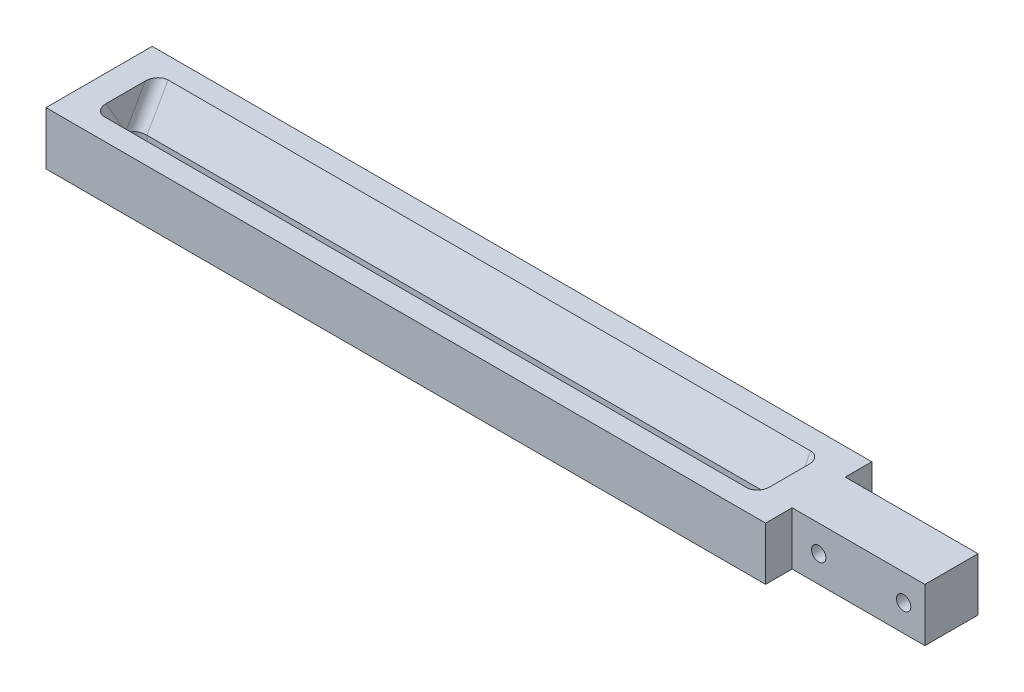
ISO-10303-21;
HEADER;
FILE_DESCRIPTION(('STEP AP214'),'2;1');
FILE_NAME('part.step','',(''),(''),'','','');
FILE_SCHEMA(('AUTOMOTIVE_DESIGN { 1 0 10303 214 1 1 1 1 }'));
ENDSEC;
DATA;
#1=APPLICATION_CONTEXT('core data for automotive mechanical design processes');
#2=APPLICATION_PROTOCOL_DEFINITION('international standard','automotive_design',2000,#1);
#3=PRODUCT_CONTEXT('',#1,'mechanical');
#4=PRODUCT('Part','Part','',(#3));
#5=PRODUCT_RELATED_PRODUCT_CATEGORY('part','',(#4));
#6=PRODUCT_DEFINITION_FORMATION('','',#4);
#7=PRODUCT_DEFINITION_CONTEXT('part definition',#1,'design');
#8=PRODUCT_DEFINITION('design','',#6,#7);
#9=PRODUCT_DEFINITION_SHAPE('','',#8);
#10=(LENGTH_UNIT() NAMED_UNIT(*) SI_UNIT(.MILLI.,.METRE.));
#11=(NAMED_UNIT(*) PLANE_ANGLE_UNIT() SI_UNIT($,.RADIAN.));
#12=(NAMED_UNIT(*) SI_UNIT($,.STERADIAN.) SOLID_ANGLE_UNIT());
#13=UNCERTAINTY_MEASURE_WITH_UNIT(LENGTH_MEASURE(1.E-05),#10,'distance_accuracy_value','');
#14=(GEOMETRIC_REPRESENTATION_CONTEXT(3) GLOBAL_UNCERTAINTY_ASSIGNED_CONTEXT((#13)) GLOBAL_UNIT_ASSIGNED_CONTEXT((#10,
#11,#12)) REPRESENTATION_CONTEXT('',''));
#15=CARTESIAN_POINT('',(0.,0.,0.));
#16=DIRECTION('',(0.,0.,1.));
#17=DIRECTION('',(1.,0.,0.));
#18=AXIS2_PLACEMENT_3D('',#15,#16,#17);
#19=CARTESIAN_POINT('',(0.,10.,0.));
#20=DIRECTION('',(0.,1.,0.));
#21=DIRECTION('',(0.,0.,1.));
#22=AXIS2_PLACEMENT_3D('',#19,#20,#21);
#23=PLANE('',#22);
#24=DIRECTION('',(1.,0.,0.));
#25=VECTOR('',#24,1.);
#26=CARTESIAN_POINT('',(93.,10.,-5.));
#27=LINE('',#26,#25);
#28=CARTESIAN_POINT('',(68.,10.,-5.));
#29=VERTEX_POINT('',#28);
#30=CARTESIAN_POINT('',(93.,10.,-5.));
#31=VERTEX_POINT('',#30);
#32=EDGE_CURVE('E51',#29,#31,#27,.T.);
#33=ORIENTED_EDGE('',*,*,#32,.F.);
#34=DIRECTION('',(0.,0.,1.));
#35=VECTOR('',#34,1.);
#36=CARTESIAN_POINT('',(68.,10.,-9.99999999999999));
#37=LINE('',#36,#35);
#38=CARTESIAN_POINT('',(68.,10.,-9.99999999999999));
#39=VERTEX_POINT('',#38);
#40=EDGE_CURVE('E287',#39,#29,#37,.T.);
#41=ORIENTED_EDGE('',*,*,#40,.F.);
#42=DIRECTION('',(-1.,0.,0.));
#43=VECTOR('',#42,1.);
#44=CARTESIAN_POINT('',(-67.5,10.,-10.));
#45=LINE('',#44,#43);
#46=CARTESIAN_POINT('',(-67.5,10.,-10.));
#47=VERTEX_POINT('',#46);
#48=EDGE_CURVE('E178',#39,#47,#45,.T.);
#49=ORIENTED_EDGE('',*,*,#48,.T.);
#50=DIRECTION('',(0.,0.,1.));
#51=VECTOR('',#50,1.);
#52=CARTESIAN_POINT('',(-67.5,10.,10.));
#53=LINE('',#52,#51);
#54=CARTESIAN_POINT('',(-67.5,10.,10.));
#55=VERTEX_POINT('',#54);
#56=EDGE_CURVE('E198',#47,#55,#53,.T.);
#57=ORIENTED_EDGE('',*,*,#56,.T.);
#58=DIRECTION('',(1.,0.,0.));
#59=VECTOR('',#58,1.);
#60=CARTESIAN_POINT('',(-67.5,10.,10.));
#61=LINE('',#60,#59);
#62=CARTESIAN_POINT('',(68.,10.,10.));
#63=VERTEX_POINT('',#62);
#64=EDGE_CURVE('E187',#55,#63,#61,.T.);
#65=ORIENTED_EDGE('',*,*,#64,.T.);
#66=DIRECTION('',(0.,0.,1.));
#67=VECTOR('',#66,1.);
#68=CARTESIAN_POINT('',(68.,10.,10.));
#69=LINE('',#68,#67);
#70=CARTESIAN_POINT('',(68.,10.,5.));
#71=VERTEX_POINT('',#70);
#72=EDGE_CURVE('E276',#71,#63,#69,.T.);
#73=ORIENTED_EDGE('',*,*,#72,.F.);
#74=DIRECTION('',(-1.,0.,0.));
#75=VECTOR('',#74,1.);
#76=CARTESIAN_POINT('',(93.,10.,5.));
#77=LINE('',#76,#75);
#78=CARTESIAN_POINT('',(93.,10.,5.));
#79=VERTEX_POINT('',#78);
#80=EDGE_CURVE('E280',#79,#71,#77,.T.);
#81=ORIENTED_EDGE('',*,*,#80,.F.);
#82=DIRECTION('',(0.,0.,-1.));
#83=VECTOR('',#82,1.);
#84=CARTESIAN_POINT('',(93.,10.,10.));
#85=LINE('',#84,#83);
#86=EDGE_CURVE('E294',#79,#31,#85,.T.);
#87=ORIENTED_EDGE('',*,*,#86,.T.);
#88=EDGE_LOOP('',(#33,#41,#49,#57,#65,#73,#81,#87));
#89=FACE_BOUND('',#88,.T.);
#90=DIRECTION('',(1.,0.,0.));
#91=VECTOR('',#90,1.);
#92=CARTESIAN_POINT('',(-62.5,10.,6.));
#93=LINE('',#92,#91);
#94=CARTESIAN_POINT('',(-60.5,10.,6.));
#95=VERTEX_POINT('',#94);
#96=CARTESIAN_POINT('',(60.5,10.,6.));
#97=VERTEX_POINT('',#96);
#98=EDGE_CURVE('E301',#95,#97,#93,.T.);
#99=ORIENTED_EDGE('',*,*,#98,.F.);
#100=CARTESIAN_POINT('',(-60.5,10.,3.69649778620041));
#101=DIRECTION('',(0.,1.,0.));
#102=DIRECTION('',(0.,0.,-1.));
#103=AXIS2_PLACEMENT_3D('',#100,#101,#102);
#104=ELLIPSE('',#103,2.30350221379959,2.);
#105=CARTESIAN_POINT('',(-62.5,10.,3.69649778620041));
#106=VERTEX_POINT('',#105);
#107=EDGE_CURVE('E232',#95,#106,#104,.F.);
#108=ORIENTED_EDGE('',*,*,#107,.T.);
#109=DIRECTION('',(0.,0.,1.));
#110=VECTOR('',#109,1.);
#111=CARTESIAN_POINT('',(-62.5,10.,-6.));
#112=LINE('',#111,#110);
#113=CARTESIAN_POINT('',(-62.5,10.,-3.69649778620041));
#114=VERTEX_POINT('',#113);
#115=EDGE_CURVE('E298',#114,#106,#112,.T.);
#116=ORIENTED_EDGE('',*,*,#115,.F.);
#117=CARTESIAN_POINT('',(-60.5,10.,-3.69649778620041));
#118=DIRECTION('',(0.,1.,0.));
#119=DIRECTION('',(0.,0.,-1.));
#120=AXIS2_PLACEMENT_3D('',#117,#118,#119);
#121=ELLIPSE('',#120,2.30350221379959,2.);
#122=CARTESIAN_POINT('',(-60.5,10.,-6.));
#123=VERTEX_POINT('',#122);
#124=EDGE_CURVE('E230',#114,#123,#121,.F.);
#125=ORIENTED_EDGE('',*,*,#124,.T.);
#126=DIRECTION('',(1.,0.,0.));
#127=VECTOR('',#126,1.);
#128=CARTESIAN_POINT('',(-62.5,10.,-6.));
#129=LINE('',#128,#127);
#130=CARTESIAN_POINT('',(60.5,10.,-6.));
#131=VERTEX_POINT('',#130);
#132=EDGE_CURVE('E190',#123,#131,#129,.T.);
#133=ORIENTED_EDGE('',*,*,#132,.T.);
#134=CARTESIAN_POINT('',(60.5,10.,-3.69649778620041));
#135=DIRECTION('',(0.,1.,0.));
#136=DIRECTION('',(0.,0.,1.));
#137=AXIS2_PLACEMENT_3D('',#134,#135,#136);
#138=ELLIPSE('',#137,2.30350221379959,2.);
#139=CARTESIAN_POINT('',(62.5,10.,-3.69649778620041));
#140=VERTEX_POINT('',#139);
#141=EDGE_CURVE('E228',#131,#140,#138,.F.);
#142=ORIENTED_EDGE('',*,*,#141,.T.);
#143=DIRECTION('',(0.,0.,1.));
#144=VECTOR('',#143,1.);
#145=CARTESIAN_POINT('',(62.5,10.,-6.));
#146=LINE('',#145,#144);
#147=CARTESIAN_POINT('',(62.5,10.,3.69649778620041));
#148=VERTEX_POINT('',#147);
#149=EDGE_CURVE('E248',#140,#148,#146,.T.);
#150=ORIENTED_EDGE('',*,*,#149,.T.);
#151=CARTESIAN_POINT('',(60.5,10.,3.69649778620041));
#152=DIRECTION('',(0.,1.,0.));
#153=DIRECTION('',(0.,0.,1.));
#154=AXIS2_PLACEMENT_3D('',#151,#152,#153);
#155=ELLIPSE('',#154,2.30350221379959,2.);
#156=EDGE_CURVE('E226',#148,#97,#155,.F.);
#157=ORIENTED_EDGE('',*,*,#156,.T.);
#158=EDGE_LOOP('',(#99,#108,#116,#125,#133,#142,#150,#157));
#159=FACE_BOUND('',#158,.T.);
#160=ADVANCED_FACE('F34',(#89,#159),#23,.T.);
#161=CARTESIAN_POINT('',(0.,0.,0.));
#162=DIRECTION('',(0.,1.,0.));
#163=DIRECTION('',(0.,0.,1.));
#164=AXIS2_PLACEMENT_3D('',#161,#162,#163);
#165=PLANE('',#164);
#166=DIRECTION('',(0.,0.,1.));
#167=VECTOR('',#166,1.);
#168=CARTESIAN_POINT('',(68.,0.,-9.99999999999999));
#169=LINE('',#168,#167);
#170=CARTESIAN_POINT('',(68.,0.,-9.99999999999999));
#171=VERTEX_POINT('',#170);
#172=CARTESIAN_POINT('',(68.,0.,-5.));
#173=VERTEX_POINT('',#172);
#174=EDGE_CURVE('E159',#171,#173,#169,.T.);
#175=ORIENTED_EDGE('',*,*,#174,.T.);
#176=DIRECTION('',(1.,0.,0.));
#177=VECTOR('',#176,1.);
#178=CARTESIAN_POINT('',(93.,0.,-5.));
#179=LINE('',#178,#177);
#180=CARTESIAN_POINT('',(93.,0.,-5.));
#181=VERTEX_POINT('',#180);
#182=EDGE_CURVE('E170',#173,#181,#179,.T.);
#183=ORIENTED_EDGE('',*,*,#182,.T.);
#184=DIRECTION('',(0.,0.,1.));
#185=VECTOR('',#184,1.);
#186=CARTESIAN_POINT('',(93.,0.,10.));
#187=LINE('',#186,#185);
#188=CARTESIAN_POINT('',(93.,0.,5.));
#189=VERTEX_POINT('',#188);
#190=EDGE_CURVE('E253',#181,#189,#187,.T.);
#191=ORIENTED_EDGE('',*,*,#190,.T.);
#192=DIRECTION('',(-1.,0.,0.));
#193=VECTOR('',#192,1.);
#194=CARTESIAN_POINT('',(93.,0.,5.));
#195=LINE('',#194,#193);
#196=CARTESIAN_POINT('',(68.,0.,5.));
#197=VERTEX_POINT('',#196);
#198=EDGE_CURVE('E59',#189,#197,#195,.T.);
#199=ORIENTED_EDGE('',*,*,#198,.T.);
#200=DIRECTION('',(0.,0.,1.));
#201=VECTOR('',#200,1.);
#202=CARTESIAN_POINT('',(68.,0.,10.));
#203=LINE('',#202,#201);
#204=CARTESIAN_POINT('',(68.,0.,10.));
#205=VERTEX_POINT('',#204);
#206=EDGE_CURVE('E275',#197,#205,#203,.T.);
#207=ORIENTED_EDGE('',*,*,#206,.T.);
#208=DIRECTION('',(1.,0.,0.));
#209=VECTOR('',#208,1.);
#210=CARTESIAN_POINT('',(-67.5,0.,10.));
#211=LINE('',#210,#209);
#212=CARTESIAN_POINT('',(-67.5,0.,10.));
#213=VERTEX_POINT('',#212);
#214=EDGE_CURVE('E185',#213,#205,#211,.T.);
#215=ORIENTED_EDGE('',*,*,#214,.F.);
#216=DIRECTION('',(0.,0.,1.));
#217=VECTOR('',#216,1.);
#218=CARTESIAN_POINT('',(-67.5,0.,10.));
#219=LINE('',#218,#217);
#220=CARTESIAN_POINT('',(-67.5,0.,-10.));
#221=VERTEX_POINT('',#220);
#222=EDGE_CURVE('E184',#221,#213,#219,.T.);
#223=ORIENTED_EDGE('',*,*,#222,.F.);
#224=DIRECTION('',(-1.,0.,0.));
#225=VECTOR('',#224,1.);
#226=CARTESIAN_POINT('',(-67.5,0.,-10.));
#227=LINE('',#226,#225);
#228=EDGE_CURVE('E176',#171,#221,#227,.T.);
#229=ORIENTED_EDGE('',*,*,#228,.F.);
#230=EDGE_LOOP('',(#175,#183,#191,#199,#207,#215,#223,#229));
#231=FACE_BOUND('',#230,.T.);
#232=CARTESIAN_POINT('',(-60.5,0.,0.));
#233=DIRECTION('',(0.,1.,0.));
#234=DIRECTION('',(0.,0.,1.));
#235=AXIS2_PLACEMENT_3D('',#232,#233,#234);
#236=CIRCLE('',#235,2.);
#237=CARTESIAN_POINT('',(-60.5,0.,-2.));
#238=VERTEX_POINT('',#237);
#239=CARTESIAN_POINT('',(-62.5,0.,0.));
#240=VERTEX_POINT('',#239);
#241=EDGE_CURVE('E234',#238,#240,#236,.T.);
#242=ORIENTED_EDGE('',*,*,#241,.T.);
#243=CARTESIAN_POINT('',(-60.5,0.,0.));
#244=DIRECTION('',(0.,1.,0.));
#245=DIRECTION('',(0.,0.,1.));
#246=AXIS2_PLACEMENT_3D('',#243,#244,#245);
#247=CIRCLE('',#246,2.);
#248=CARTESIAN_POINT('',(-60.5,0.,2.));
#249=VERTEX_POINT('',#248);
#250=EDGE_CURVE('E11',#240,#249,#247,.T.);
#251=ORIENTED_EDGE('',*,*,#250,.T.);
#252=DIRECTION('',(1.,0.,0.));
#253=VECTOR('',#252,1.);
#254=CARTESIAN_POINT('',(-62.5,0.,2.));
#255=LINE('',#254,#253);
#256=CARTESIAN_POINT('',(60.5,0.,2.));
#257=VERTEX_POINT('',#256);
#258=EDGE_CURVE('E312',#249,#257,#255,.T.);
#259=ORIENTED_EDGE('',*,*,#258,.T.);
#260=CARTESIAN_POINT('',(60.5,0.,0.));
#261=DIRECTION('',(0.,1.,0.));
#262=DIRECTION('',(0.,0.,1.));
#263=AXIS2_PLACEMENT_3D('',#260,#261,#262);
#264=CIRCLE('',#263,2.);
#265=CARTESIAN_POINT('',(62.5,0.,0.));
#266=VERTEX_POINT('',#265);
#267=EDGE_CURVE('E43',#257,#266,#264,.T.);
#268=ORIENTED_EDGE('',*,*,#267,.T.);
#269=CARTESIAN_POINT('',(60.5,0.,0.));
#270=DIRECTION('',(0.,1.,0.));
#271=DIRECTION('',(0.,0.,1.));
#272=AXIS2_PLACEMENT_3D('',#269,#270,#271);
#273=CIRCLE('',#272,2.);
#274=CARTESIAN_POINT('',(60.5,0.,-2.));
#275=VERTEX_POINT('',#274);
#276=EDGE_CURVE('E236',#266,#275,#273,.T.);
#277=ORIENTED_EDGE('',*,*,#276,.T.);
#278=DIRECTION('',(1.,0.,0.));
#279=VECTOR('',#278,1.);
#280=CARTESIAN_POINT('',(-62.5,0.,-2.));
#281=LINE('',#280,#279);
#282=EDGE_CURVE('E309',#238,#275,#281,.T.);
#283=ORIENTED_EDGE('',*,*,#282,.F.);
#284=EDGE_LOOP('',(#242,#251,#259,#268,#277,#283));
#285=FACE_BOUND('',#284,.T.);
#286=ADVANCED_FACE('F181',(#231,#285),#165,.F.);
#287=CARTESIAN_POINT('',(-67.5,10.,10.));
#288=DIRECTION('',(0.,0.,-1.));
#289=DIRECTION('',(-1.,0.,0.));
#290=AXIS2_PLACEMENT_3D('',#287,#288,#289);
#291=PLANE('',#290);
#292=ORIENTED_EDGE('',*,*,#214,.T.);
#293=DIRECTION('',(0.,1.,0.));
#294=VECTOR('',#293,1.);
#295=CARTESIAN_POINT('',(68.,0.,10.));
#296=LINE('',#295,#294);
#297=EDGE_CURVE('E284',#205,#63,#296,.T.);
#298=ORIENTED_EDGE('',*,*,#297,.T.);
#299=ORIENTED_EDGE('',*,*,#64,.F.);
#300=DIRECTION('',(0.,-1.,0.));
#301=VECTOR('',#300,1.);
#302=CARTESIAN_POINT('',(-67.5,10.,10.));
#303=LINE('',#302,#301);
#304=EDGE_CURVE('E194',#55,#213,#303,.T.);
#305=ORIENTED_EDGE('',*,*,#304,.T.);
#306=EDGE_LOOP('',(#292,#298,#299,#305));
#307=FACE_BOUND('',#306,.T.);
#308=ADVANCED_FACE('F331',(#307),#291,.F.);
#309=CARTESIAN_POINT('',(-67.5,10.,-10.));
#310=DIRECTION('',(0.,0.,1.));
#311=DIRECTION('',(1.,0.,0.));
#312=AXIS2_PLACEMENT_3D('',#309,#310,#311);
#313=PLANE('',#312);
#314=ORIENTED_EDGE('',*,*,#48,.F.);
#315=DIRECTION('',(0.,1.,0.));
#316=VECTOR('',#315,1.);
#317=CARTESIAN_POINT('',(68.,0.,-9.99999999999999));
#318=LINE('',#317,#316);
#319=EDGE_CURVE('E163',#171,#39,#318,.T.);
#320=ORIENTED_EDGE('',*,*,#319,.F.);
#321=ORIENTED_EDGE('',*,*,#228,.T.);
#322=DIRECTION('',(0.,-1.,0.));
#323=VECTOR('',#322,1.);
#324=CARTESIAN_POINT('',(-67.5,10.,-10.));
#325=LINE('',#324,#323);
#326=EDGE_CURVE('E197',#47,#221,#325,.T.);
#327=ORIENTED_EDGE('',*,*,#326,.F.);
#328=EDGE_LOOP('',(#314,#320,#321,#327));
#329=FACE_BOUND('',#328,.T.);
#330=ADVANCED_FACE('F174',(#329),#313,.F.);
#331=CARTESIAN_POINT('',(-67.5,10.,10.));
#332=DIRECTION('',(1.,0.,0.));
#333=DIRECTION('',(0.,0.,-1.));
#334=AXIS2_PLACEMENT_3D('',#331,#332,#333);
#335=PLANE('',#334);
#336=ORIENTED_EDGE('',*,*,#222,.T.);
#337=ORIENTED_EDGE('',*,*,#304,.F.);
#338=ORIENTED_EDGE('',*,*,#56,.F.);
#339=ORIENTED_EDGE('',*,*,#326,.T.);
#340=EDGE_LOOP('',(#336,#337,#338,#339));
#341=FACE_BOUND('',#340,.T.);
#342=ADVANCED_FACE('F329',(#341),#335,.F.);
#343=CARTESIAN_POINT('',(-62.5,10.,-6.));
#344=DIRECTION('',(0.,-0.496138938356834,-0.868243142124459));
#345=DIRECTION('',(0.,0.868243142124459,-0.496138938356834));
#346=AXIS2_PLACEMENT_3D('',#343,#344,#345);
#347=PLANE('',#346);
#348=DIRECTION('',(1.,0.,0.));
#349=VECTOR('',#348,1.);
#350=CARTESIAN_POINT('',(-62.5,3.,-2.));
#351=LINE('',#350,#349);
#352=CARTESIAN_POINT('',(-60.5,3.,-2.));
#353=VERTEX_POINT('',#352);
#354=CARTESIAN_POINT('',(60.5,3.,-2.));
#355=VERTEX_POINT('',#354);
#356=EDGE_CURVE('E306',#353,#355,#351,.T.);
#357=ORIENTED_EDGE('',*,*,#356,.T.);
#358=DIRECTION('',(0.,0.868243142124459,-0.496138938356834));
#359=VECTOR('',#358,1.);
#360=CARTESIAN_POINT('',(60.5,10.,-6.));
#361=LINE('',#360,#359);
#362=EDGE_CURVE('E211',#355,#131,#361,.T.);
#363=ORIENTED_EDGE('',*,*,#362,.T.);
#364=ORIENTED_EDGE('',*,*,#132,.F.);
#365=DIRECTION('',(0.,0.868243142124459,-0.496138938356834));
#366=VECTOR('',#365,1.);
#367=CARTESIAN_POINT('',(-60.5,10.,-6.));
#368=LINE('',#367,#366);
#369=EDGE_CURVE('E209',#123,#353,#368,.F.);
#370=ORIENTED_EDGE('',*,*,#369,.T.);
#371=EDGE_LOOP('',(#357,#363,#364,#370));
#372=FACE_BOUND('',#371,.T.);
#373=ADVANCED_FACE('F371',(#372),#347,.F.);
#374=CARTESIAN_POINT('',(-62.5,0.,-2.));
#375=DIRECTION('',(0.,0.,-1.));
#376=DIRECTION('',(0.,1.,0.));
#377=AXIS2_PLACEMENT_3D('',#374,#375,#376);
#378=PLANE('',#377);
#379=ORIENTED_EDGE('',*,*,#356,.F.);
#380=DIRECTION('',(0.,1.,0.));
#381=VECTOR('',#380,1.);
#382=CARTESIAN_POINT('',(-60.5,0.,-2.));
#383=LINE('',#382,#381);
#384=EDGE_CURVE('E220',#353,#238,#383,.F.);
#385=ORIENTED_EDGE('',*,*,#384,.T.);
#386=ORIENTED_EDGE('',*,*,#282,.T.);
#387=DIRECTION('',(0.,1.,0.));
#388=VECTOR('',#387,1.);
#389=CARTESIAN_POINT('',(60.5,3.,-2.));
#390=LINE('',#389,#388);
#391=EDGE_CURVE('E218',#275,#355,#390,.T.);
#392=ORIENTED_EDGE('',*,*,#391,.T.);
#393=EDGE_LOOP('',(#379,#385,#386,#392));
#394=FACE_BOUND('',#393,.T.);
#395=ADVANCED_FACE('F448',(#394),#378,.F.);
#396=CARTESIAN_POINT('',(-62.5,3.,2.));
#397=DIRECTION('',(0.,0.,1.));
#398=DIRECTION('',(0.,-1.,0.));
#399=AXIS2_PLACEMENT_3D('',#396,#397,#398);
#400=PLANE('',#399);
#401=DIRECTION('',(1.,0.,0.));
#402=VECTOR('',#401,1.);
#403=CARTESIAN_POINT('',(-62.5,3.,2.));
#404=LINE('',#403,#402);
#405=CARTESIAN_POINT('',(-60.5,3.,2.));
#406=VERTEX_POINT('',#405);
#407=CARTESIAN_POINT('',(60.5,3.,2.));
#408=VERTEX_POINT('',#407);
#409=EDGE_CURVE('E315',#406,#408,#404,.T.);
#410=ORIENTED_EDGE('',*,*,#409,.T.);
#411=DIRECTION('',(0.,-1.,0.));
#412=VECTOR('',#411,1.);
#413=CARTESIAN_POINT('',(60.5,0.,2.));
#414=LINE('',#413,#412);
#415=EDGE_CURVE('E224',#408,#257,#414,.T.);
#416=ORIENTED_EDGE('',*,*,#415,.T.);
#417=ORIENTED_EDGE('',*,*,#258,.F.);
#418=DIRECTION('',(0.,-1.,0.));
#419=VECTOR('',#418,1.);
#420=CARTESIAN_POINT('',(-60.5,3.,2.));
#421=LINE('',#420,#419);
#422=EDGE_CURVE('E222',#249,#406,#421,.F.);
#423=ORIENTED_EDGE('',*,*,#422,.T.);
#424=EDGE_LOOP('',(#410,#416,#417,#423));
#425=FACE_BOUND('',#424,.T.);
#426=ADVANCED_FACE('F414',(#425),#400,.F.);
#427=CARTESIAN_POINT('',(-62.5,10.,6.));
#428=DIRECTION('',(0.,-0.496138938356834,0.868243142124459));
#429=DIRECTION('',(0.,-0.868243142124459,-0.496138938356834));
#430=AXIS2_PLACEMENT_3D('',#427,#428,#429);
#431=PLANE('',#430);
#432=ORIENTED_EDGE('',*,*,#98,.T.);
#433=DIRECTION('',(0.,-0.868243142124459,-0.496138938356834));
#434=VECTOR('',#433,1.);
#435=CARTESIAN_POINT('',(60.5,3.,2.));
#436=LINE('',#435,#434);
#437=EDGE_CURVE('E202',#97,#408,#436,.T.);
#438=ORIENTED_EDGE('',*,*,#437,.T.);
#439=ORIENTED_EDGE('',*,*,#409,.F.);
#440=DIRECTION('',(0.,-0.868243142124459,-0.496138938356834));
#441=VECTOR('',#440,1.);
#442=CARTESIAN_POINT('',(-60.5,10.,6.));
#443=LINE('',#442,#441);
#444=EDGE_CURVE('E200',#406,#95,#443,.F.);
#445=ORIENTED_EDGE('',*,*,#444,.T.);
#446=EDGE_LOOP('',(#432,#438,#439,#445));
#447=FACE_BOUND('',#446,.T.);
#448=ADVANCED_FACE('F366',(#447),#431,.F.);
#449=CARTESIAN_POINT('',(-62.5,0.,0.));
#450=DIRECTION('',(1.,0.,0.));
#451=DIRECTION('',(0.,0.,-1.));
#452=AXIS2_PLACEMENT_3D('',#449,#450,#451);
#453=PLANE('',#452);
#454=DIRECTION('',(0.,-0.868243142124459,-0.496138938356834));
#455=VECTOR('',#454,1.);
#456=CARTESIAN_POINT('',(-62.5,0.869200953636746,-1.5211016688643));
#457=LINE('',#456,#455);
#458=CARTESIAN_POINT('',(-62.5,3.53112887414928,0.));
#459=VERTEX_POINT('',#458);
#460=EDGE_CURVE('E213',#106,#459,#457,.T.);
#461=ORIENTED_EDGE('',*,*,#460,.T.);
#462=DIRECTION('',(0.,0.868243142124459,-0.496138938356834));
#463=VECTOR('',#462,1.);
#464=CARTESIAN_POINT('',(-62.5,0.869200953636745,1.5211016688643));
#465=LINE('',#464,#463);
#466=EDGE_CURVE('E215',#459,#114,#465,.T.);
#467=ORIENTED_EDGE('',*,*,#466,.T.);
#468=ORIENTED_EDGE('',*,*,#115,.T.);
#469=EDGE_LOOP('',(#461,#467,#468));
#470=FACE_BOUND('',#469,.T.);
#471=ADVANCED_FACE('F423',(#470),#453,.T.);
#472=CARTESIAN_POINT('',(62.5,0.,0.));
#473=DIRECTION('',(1.,0.,0.));
#474=DIRECTION('',(0.,0.,-1.));
#475=AXIS2_PLACEMENT_3D('',#472,#473,#474);
#476=PLANE('',#475);
#477=DIRECTION('',(0.,0.868243142124459,-0.496138938356834));
#478=VECTOR('',#477,1.);
#479=CARTESIAN_POINT('',(62.5,3.99227787671367,-0.26351371575108));
#480=LINE('',#479,#478);
#481=CARTESIAN_POINT('',(62.5,3.53112887414928,0.));
#482=VERTEX_POINT('',#481);
#483=EDGE_CURVE('E205',#140,#482,#480,.F.);
#484=ORIENTED_EDGE('',*,*,#483,.T.);
#485=DIRECTION('',(0.,-0.868243142124459,-0.496138938356834));
#486=VECTOR('',#485,1.);
#487=CARTESIAN_POINT('',(62.5,10.9922778767137,4.26351371575108));
#488=LINE('',#487,#486);
#489=EDGE_CURVE('E207',#482,#148,#488,.F.);
#490=ORIENTED_EDGE('',*,*,#489,.T.);
#491=ORIENTED_EDGE('',*,*,#149,.F.);
#492=EDGE_LOOP('',(#484,#490,#491));
#493=FACE_BOUND('',#492,.T.);
#494=ADVANCED_FACE('F391',(#493),#476,.F.);
#495=CARTESIAN_POINT('',(60.5,10.9922778767137,-4.26351371575108));
#496=DIRECTION('',(0.,-0.868243142124459,0.496138938356834));
#497=DIRECTION('',(0.,-0.496138938356834,-0.868243142124459));
#498=AXIS2_PLACEMENT_3D('',#495,#496,#497);
#499=CYLINDRICAL_SURFACE('',#498,2.);
#500=ORIENTED_EDGE('',*,*,#141,.F.);
#501=ORIENTED_EDGE('',*,*,#362,.F.);
#502=CARTESIAN_POINT('',(60.5,3.53112887414927,0.));
#503=DIRECTION('',(0.,-0.96649964876467,0.256667935157024));
#504=DIRECTION('',(0.,-0.256667935157024,-0.96649964876467));
#505=AXIS2_PLACEMENT_3D('',#502,#503,#504);
#506=ELLIPSE('',#505,2.06932304895951,2.);
#507=EDGE_CURVE('E245',#482,#355,#506,.F.);
#508=ORIENTED_EDGE('',*,*,#507,.F.);
#509=ORIENTED_EDGE('',*,*,#483,.F.);
#510=EDGE_LOOP('',(#500,#501,#508,#509));
#511=FACE_BOUND('',#510,.T.);
#512=ADVANCED_FACE('F387',(#511),#499,.F.);
#513=CARTESIAN_POINT('',(60.5,0.,0.));
#514=DIRECTION('',(0.,-1.,0.));
#515=DIRECTION('',(0.,0.,-1.));
#516=AXIS2_PLACEMENT_3D('',#513,#514,#515);
#517=CYLINDRICAL_SURFACE('',#516,2.);
#518=ORIENTED_EDGE('',*,*,#391,.F.);
#519=ORIENTED_EDGE('',*,*,#276,.F.);
#520=DIRECTION('',(0.,1.,0.));
#521=VECTOR('',#520,1.);
#522=CARTESIAN_POINT('',(62.5,0.,0.));
#523=LINE('',#522,#521);
#524=EDGE_CURVE('E241',#482,#266,#523,.F.);
#525=ORIENTED_EDGE('',*,*,#524,.F.);
#526=ORIENTED_EDGE('',*,*,#507,.T.);
#527=EDGE_LOOP('',(#518,#519,#525,#526));
#528=FACE_BOUND('',#527,.T.);
#529=ADVANCED_FACE('F383',(#528),#517,.F.);
#530=CARTESIAN_POINT('',(60.5,3.,0.));
#531=DIRECTION('',(0.,1.,0.));
#532=DIRECTION('',(0.,0.,1.));
#533=AXIS2_PLACEMENT_3D('',#530,#531,#532);
#534=CYLINDRICAL_SURFACE('',#533,2.);
#535=ORIENTED_EDGE('',*,*,#267,.F.);
#536=ORIENTED_EDGE('',*,*,#415,.F.);
#537=CARTESIAN_POINT('',(60.5,3.53112887414927,0.));
#538=DIRECTION('',(0.,0.966499648764669,0.256667935157025));
#539=DIRECTION('',(0.,0.256667935157025,-0.966499648764669));
#540=AXIS2_PLACEMENT_3D('',#537,#538,#539);
#541=ELLIPSE('',#540,2.06932304895951,2.);
#542=EDGE_CURVE('E239',#482,#408,#541,.F.);
#543=ORIENTED_EDGE('',*,*,#542,.F.);
#544=ORIENTED_EDGE('',*,*,#524,.T.);
#545=EDGE_LOOP('',(#535,#536,#543,#544));
#546=FACE_BOUND('',#545,.T.);
#547=ADVANCED_FACE('F379',(#546),#534,.F.);
#548=CARTESIAN_POINT('',(60.5,10.9922778767137,4.26351371575108));
#549=DIRECTION('',(0.,0.868243142124459,0.496138938356834));
#550=DIRECTION('',(0.,-0.496138938356834,0.868243142124459));
#551=AXIS2_PLACEMENT_3D('',#548,#549,#550);
#552=CYLINDRICAL_SURFACE('',#551,2.);
#553=ORIENTED_EDGE('',*,*,#156,.F.);
#554=ORIENTED_EDGE('',*,*,#489,.F.);
#555=ORIENTED_EDGE('',*,*,#542,.T.);
#556=ORIENTED_EDGE('',*,*,#437,.F.);
#557=EDGE_LOOP('',(#553,#554,#555,#556));
#558=FACE_BOUND('',#557,.T.);
#559=ADVANCED_FACE('F376',(#558),#552,.F.);
#560=CARTESIAN_POINT('',(-60.5,0.869200953636745,-1.5211016688643));
#561=DIRECTION('',(0.,-0.868243142124459,-0.496138938356834));
#562=DIRECTION('',(0.,0.496138938356834,-0.868243142124459));
#563=AXIS2_PLACEMENT_3D('',#560,#561,#562);
#564=CYLINDRICAL_SURFACE('',#563,2.);
#565=ORIENTED_EDGE('',*,*,#107,.F.);
#566=ORIENTED_EDGE('',*,*,#444,.F.);
#567=CARTESIAN_POINT('',(-60.5,3.53112887414928,0.));
#568=DIRECTION('',(0.,-0.966499648764669,-0.256667935157025));
#569=DIRECTION('',(0.,-0.256667935157025,0.966499648764669));
#570=AXIS2_PLACEMENT_3D('',#567,#568,#569);
#571=ELLIPSE('',#570,2.06932304895951,2.);
#572=EDGE_CURVE('E242',#459,#406,#571,.F.);
#573=ORIENTED_EDGE('',*,*,#572,.F.);
#574=ORIENTED_EDGE('',*,*,#460,.F.);
#575=EDGE_LOOP('',(#565,#566,#573,#574));
#576=FACE_BOUND('',#575,.T.);
#577=ADVANCED_FACE('F36',(#576),#564,.F.);
#578=CARTESIAN_POINT('',(-60.5,0.,0.));
#579=DIRECTION('',(0.,-1.,0.));
#580=DIRECTION('',(0.,0.,-1.));
#581=AXIS2_PLACEMENT_3D('',#578,#579,#580);
#582=CYLINDRICAL_SURFACE('',#581,2.);
#583=ORIENTED_EDGE('',*,*,#422,.F.);
#584=ORIENTED_EDGE('',*,*,#250,.F.);
#585=DIRECTION('',(0.,-1.,0.));
#586=VECTOR('',#585,1.);
#587=CARTESIAN_POINT('',(-62.5,0.,0.));
#588=LINE('',#587,#586);
#589=EDGE_CURVE('E252',#459,#240,#588,.T.);
#590=ORIENTED_EDGE('',*,*,#589,.F.);
#591=ORIENTED_EDGE('',*,*,#572,.T.);
#592=EDGE_LOOP('',(#583,#584,#590,#591));
#593=FACE_BOUND('',#592,.T.);
#594=ADVANCED_FACE('F399',(#593),#582,.F.);
#595=CARTESIAN_POINT('',(-60.5,0.,0.));
#596=DIRECTION('',(0.,1.,0.));
#597=DIRECTION('',(0.,0.,1.));
#598=AXIS2_PLACEMENT_3D('',#595,#596,#597);
#599=CYLINDRICAL_SURFACE('',#598,2.);
#600=ORIENTED_EDGE('',*,*,#241,.F.);
#601=ORIENTED_EDGE('',*,*,#384,.F.);
#602=CARTESIAN_POINT('',(-60.5,3.53112887414928,0.));
#603=DIRECTION('',(0.,0.96649964876467,-0.256667935157024));
#604=DIRECTION('',(0.,0.256667935157024,0.96649964876467));
#605=AXIS2_PLACEMENT_3D('',#602,#603,#604);
#606=ELLIPSE('',#605,2.06932304895951,2.);
#607=EDGE_CURVE('E249',#459,#353,#606,.F.);
#608=ORIENTED_EDGE('',*,*,#607,.F.);
#609=ORIENTED_EDGE('',*,*,#589,.T.);
#610=EDGE_LOOP('',(#600,#601,#608,#609));
#611=FACE_BOUND('',#610,.T.);
#612=ADVANCED_FACE('F396',(#611),#599,.F.);
#613=CARTESIAN_POINT('',(-60.5,0.869200953636745,1.5211016688643));
#614=DIRECTION('',(0.,0.868243142124459,-0.496138938356834));
#615=DIRECTION('',(0.,0.496138938356834,0.868243142124459));
#616=AXIS2_PLACEMENT_3D('',#613,#614,#615);
#617=CYLINDRICAL_SURFACE('',#616,2.);
#618=ORIENTED_EDGE('',*,*,#607,.T.);
#619=ORIENTED_EDGE('',*,*,#369,.F.);
#620=ORIENTED_EDGE('',*,*,#124,.F.);
#621=ORIENTED_EDGE('',*,*,#466,.F.);
#622=EDGE_LOOP('',(#618,#619,#620,#621));
#623=FACE_BOUND('',#622,.T.);
#624=ADVANCED_FACE('F393',(#623),#617,.F.);
#625=CARTESIAN_POINT('',(93.,-32.4075608461976,10.));
#626=DIRECTION('',(1.,0.,0.));
#627=DIRECTION('',(0.,0.,-1.));
#628=AXIS2_PLACEMENT_3D('',#625,#626,#627);
#629=PLANE('',#628);
#630=DIRECTION('',(0.,1.,0.));
#631=VECTOR('',#630,1.);
#632=CARTESIAN_POINT('',(93.,0.,-5.));
#633=LINE('',#632,#631);
#634=EDGE_CURVE('E260',#181,#31,#633,.T.);
#635=ORIENTED_EDGE('',*,*,#634,.T.);
#636=ORIENTED_EDGE('',*,*,#86,.F.);
#637=DIRECTION('',(0.,1.,0.));
#638=VECTOR('',#637,1.);
#639=CARTESIAN_POINT('',(93.,0.,5.));
#640=LINE('',#639,#638);
#641=EDGE_CURVE('E279',#189,#79,#640,.T.);
#642=ORIENTED_EDGE('',*,*,#641,.F.);
#643=ORIENTED_EDGE('',*,*,#190,.F.);
#644=EDGE_LOOP('',(#635,#636,#642,#643));
#645=FACE_BOUND('',#644,.T.);
#646=ADVANCED_FACE('F335',(#645),#629,.T.);
#647=CARTESIAN_POINT('',(93.,0.,5.));
#648=DIRECTION('',(0.,0.,-1.));
#649=DIRECTION('',(-1.,0.,0.));
#650=AXIS2_PLACEMENT_3D('',#647,#648,#649);
#651=PLANE('',#650);
#652=CARTESIAN_POINT('',(89.,5.,5.));
#653=DIRECTION('',(0.,0.,-1.));
#654=DIRECTION('',(-1.,0.,0.));
#655=AXIS2_PLACEMENT_3D('',#652,#653,#654);
#656=CIRCLE('',#655,1.35000000000001);
#657=CARTESIAN_POINT('',(87.65,5.,5.));
#658=VERTEX_POINT('',#657);
#659=EDGE_CURVE('E257',#658,#658,#656,.F.);
#660=ORIENTED_EDGE('',*,*,#659,.F.);
#661=EDGE_LOOP('',(#660));
#662=FACE_BOUND('',#661,.T.);
#663=ORIENTED_EDGE('',*,*,#80,.T.);
#664=DIRECTION('',(0.,1.,0.));
#665=VECTOR('',#664,1.);
#666=CARTESIAN_POINT('',(68.,0.,5.));
#667=LINE('',#666,#665);
#668=EDGE_CURVE('E288',#197,#71,#667,.T.);
#669=ORIENTED_EDGE('',*,*,#668,.F.);
#670=ORIENTED_EDGE('',*,*,#198,.F.);
#671=ORIENTED_EDGE('',*,*,#641,.T.);
#672=EDGE_LOOP('',(#663,#669,#670,#671));
#673=FACE_BOUND('',#672,.T.);
#674=CARTESIAN_POINT('',(73.,5.,5.));
#675=DIRECTION('',(0.,0.,-1.));
#676=DIRECTION('',(-1.,0.,0.));
#677=AXIS2_PLACEMENT_3D('',#674,#675,#676);
#678=CIRCLE('',#677,1.35000000000001);
#679=CARTESIAN_POINT('',(71.65,5.,5.));
#680=VERTEX_POINT('',#679);
#681=EDGE_CURVE('E259',#680,#680,#678,.F.);
#682=ORIENTED_EDGE('',*,*,#681,.F.);
#683=EDGE_LOOP('',(#682));
#684=FACE_BOUND('',#683,.T.);
#685=ADVANCED_FACE('F337',(#662,#673,#684),#651,.F.);
#686=CARTESIAN_POINT('',(68.,0.,10.));
#687=DIRECTION('',(-1.,0.,0.));
#688=DIRECTION('',(0.,0.,1.));
#689=AXIS2_PLACEMENT_3D('',#686,#687,#688);
#690=PLANE('',#689);
#691=ORIENTED_EDGE('',*,*,#72,.T.);
#692=ORIENTED_EDGE('',*,*,#297,.F.);
#693=ORIENTED_EDGE('',*,*,#206,.F.);
#694=ORIENTED_EDGE('',*,*,#668,.T.);
#695=EDGE_LOOP('',(#691,#692,#693,#694));
#696=FACE_BOUND('',#695,.T.);
#697=ADVANCED_FACE('F334',(#696),#690,.F.);
#698=CARTESIAN_POINT('',(93.,0.,-5.));
#699=DIRECTION('',(0.,0.,1.));
#700=DIRECTION('',(1.,0.,0.));
#701=AXIS2_PLACEMENT_3D('',#698,#699,#700);
#702=PLANE('',#701);
#703=CARTESIAN_POINT('',(89.,5.,-5.));
#704=DIRECTION('',(0.,0.,1.));
#705=DIRECTION('',(1.,0.,0.));
#706=AXIS2_PLACEMENT_3D('',#703,#704,#705);
#707=CIRCLE('',#706,1.35000000000001);
#708=CARTESIAN_POINT('',(90.35,5.,-5.));
#709=VERTEX_POINT('',#708);
#710=EDGE_CURVE('E38',#709,#709,#707,.F.);
#711=ORIENTED_EDGE('',*,*,#710,.F.);
#712=EDGE_LOOP('',(#711));
#713=FACE_BOUND('',#712,.T.);
#714=ORIENTED_EDGE('',*,*,#32,.T.);
#715=ORIENTED_EDGE('',*,*,#634,.F.);
#716=ORIENTED_EDGE('',*,*,#182,.F.);
#717=DIRECTION('',(0.,1.,0.));
#718=VECTOR('',#717,1.);
#719=CARTESIAN_POINT('',(68.,0.,-5.));
#720=LINE('',#719,#718);
#721=EDGE_CURVE('E165',#173,#29,#720,.T.);
#722=ORIENTED_EDGE('',*,*,#721,.T.);
#723=EDGE_LOOP('',(#714,#715,#716,#722));
#724=FACE_BOUND('',#723,.T.);
#725=CARTESIAN_POINT('',(73.,5.,-5.));
#726=DIRECTION('',(0.,0.,1.));
#727=DIRECTION('',(1.,0.,0.));
#728=AXIS2_PLACEMENT_3D('',#725,#726,#727);
#729=CIRCLE('',#728,1.35000000000001);
#730=CARTESIAN_POINT('',(74.35,5.,-5.));
#731=VERTEX_POINT('',#730);
#732=EDGE_CURVE('E291',#731,#731,#729,.F.);
#733=ORIENTED_EDGE('',*,*,#732,.F.);
#734=EDGE_LOOP('',(#733));
#735=FACE_BOUND('',#734,.T.);
#736=ADVANCED_FACE('F356',(#713,#724,#735),#702,.F.);
#737=CARTESIAN_POINT('',(68.,0.,-9.99999999999999));
#738=DIRECTION('',(-1.,0.,0.));
#739=DIRECTION('',(0.,0.,1.));
#740=AXIS2_PLACEMENT_3D('',#737,#738,#739);
#741=PLANE('',#740);
#742=ORIENTED_EDGE('',*,*,#40,.T.);
#743=ORIENTED_EDGE('',*,*,#721,.F.);
#744=ORIENTED_EDGE('',*,*,#174,.F.);
#745=ORIENTED_EDGE('',*,*,#319,.T.);
#746=EDGE_LOOP('',(#742,#743,#744,#745));
#747=FACE_BOUND('',#746,.T.);
#748=ADVANCED_FACE('F162',(#747),#741,.F.);
#749=CARTESIAN_POINT('',(73.,5.,10.));
#750=DIRECTION('',(0.,0.,-1.));
#751=DIRECTION('',(-1.,0.,0.));
#752=AXIS2_PLACEMENT_3D('',#749,#750,#751);
#753=CYLINDRICAL_SURFACE('',#752,1.35000000000001);
#754=ORIENTED_EDGE('',*,*,#732,.T.);
#755=EDGE_LOOP('',(#754));
#756=FACE_BOUND('',#755,.T.);
#757=ORIENTED_EDGE('',*,*,#681,.T.);
#758=EDGE_LOOP('',(#757));
#759=FACE_BOUND('',#758,.T.);
#760=ADVANCED_FACE('F345',(#756,#759),#753,.F.);
#761=CARTESIAN_POINT('',(89.,5.,10.));
#762=DIRECTION('',(0.,0.,-1.));
#763=DIRECTION('',(-1.,0.,0.));
#764=AXIS2_PLACEMENT_3D('',#761,#762,#763);
#765=CYLINDRICAL_SURFACE('',#764,1.35000000000001);
#766=ORIENTED_EDGE('',*,*,#710,.T.);
#767=EDGE_LOOP('',(#766));
#768=FACE_BOUND('',#767,.T.);
#769=ORIENTED_EDGE('',*,*,#659,.T.);
#770=EDGE_LOOP('',(#769));
#771=FACE_BOUND('',#770,.T.);
#772=ADVANCED_FACE('F347',(#768,#771),#765,.F.);
#773=CLOSED_SHELL('',(#160,#286,#308,#330,#342,#373,#395,#426,#448,#471,#494,#512,#529,#547,
#559,#577,#594,#612,#624,#646,#685,#697,#736,#748,#760,#772));
#774=MANIFOLD_SOLID_BREP('B2',#773);
#775=ADVANCED_BREP_SHAPE_REPRESENTATION('',(#18,#774),#14);
#776=SHAPE_DEFINITION_REPRESENTATION(#9,#775);
ENDSEC;
END-ISO-10303-21;
